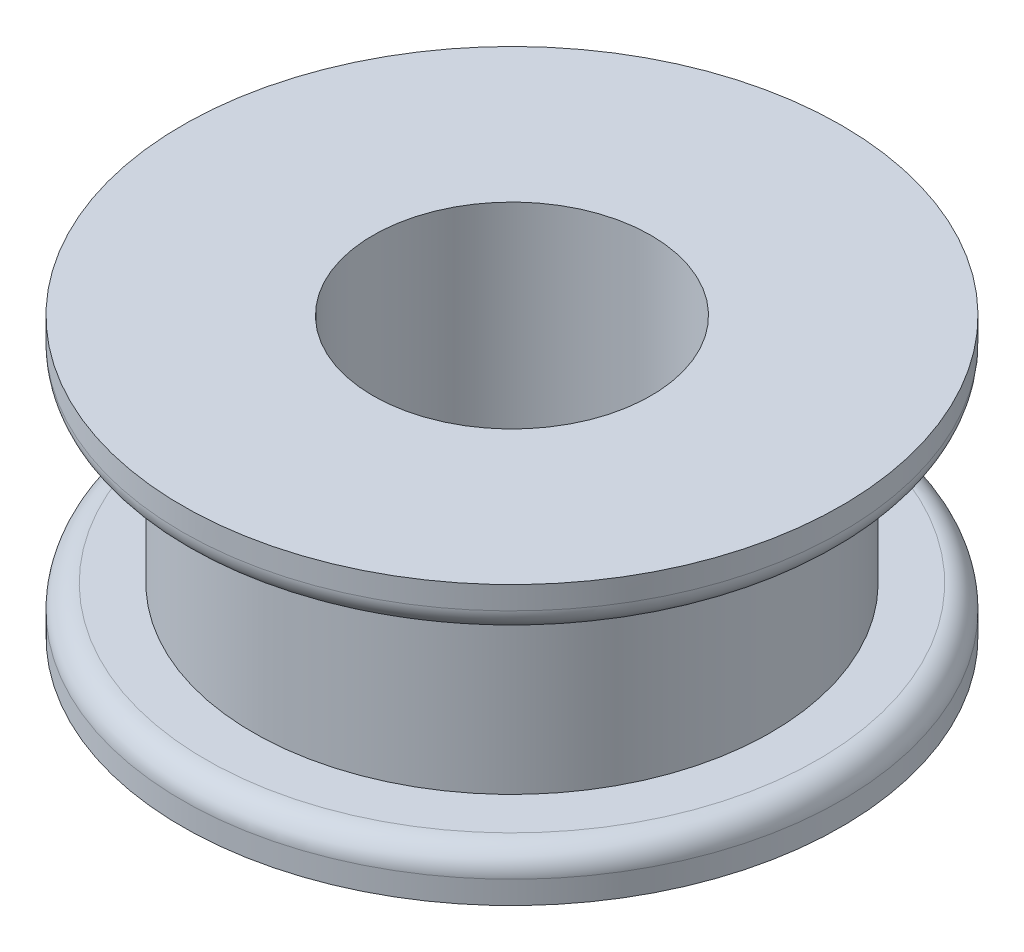
ISO-10303-21;
HEADER;
FILE_DESCRIPTION(('STEP AP214'),'2;1');
FILE_NAME('part.step','',(''),(''),'','','');
FILE_SCHEMA(('AUTOMOTIVE_DESIGN { 1 0 10303 214 1 1 1 1 }'));
ENDSEC;
DATA;
#1=APPLICATION_CONTEXT('core data for automotive mechanical design processes');
#2=APPLICATION_PROTOCOL_DEFINITION('international standard','automotive_design',2000,#1);
#3=PRODUCT_CONTEXT('',#1,'mechanical');
#4=PRODUCT('Part','Part','',(#3));
#5=PRODUCT_RELATED_PRODUCT_CATEGORY('part','',(#4));
#6=PRODUCT_DEFINITION_FORMATION('','',#4);
#7=PRODUCT_DEFINITION_CONTEXT('part definition',#1,'design');
#8=PRODUCT_DEFINITION('design','',#6,#7);
#9=PRODUCT_DEFINITION_SHAPE('','',#8);
#10=(LENGTH_UNIT() NAMED_UNIT(*) SI_UNIT(.MILLI.,.METRE.));
#11=(NAMED_UNIT(*) PLANE_ANGLE_UNIT() SI_UNIT($,.RADIAN.));
#12=(NAMED_UNIT(*) SI_UNIT($,.STERADIAN.) SOLID_ANGLE_UNIT());
#13=UNCERTAINTY_MEASURE_WITH_UNIT(LENGTH_MEASURE(1.E-05),#10,'distance_accuracy_value','');
#14=(GEOMETRIC_REPRESENTATION_CONTEXT(3) GLOBAL_UNCERTAINTY_ASSIGNED_CONTEXT((#13)) GLOBAL_UNIT_ASSIGNED_CONTEXT((#10,
#11,#12)) REPRESENTATION_CONTEXT('',''));
#15=CARTESIAN_POINT('',(0.,0.,0.));
#16=DIRECTION('',(0.,0.,1.));
#17=DIRECTION('',(1.,0.,0.));
#18=AXIS2_PLACEMENT_3D('',#15,#16,#17);
#19=CARTESIAN_POINT('',(0.,0.,7.112));
#20=DIRECTION('',(0.,-1.,0.));
#21=DIRECTION('',(0.,0.,-1.));
#22=AXIS2_PLACEMENT_3D('',#19,#20,#21);
#23=PLANE('',#22);
#24=CARTESIAN_POINT('',(0.,0.,0.));
#25=DIRECTION('',(0.,-1.,0.));
#26=DIRECTION('',(0.,0.,-1.));
#27=AXIS2_PLACEMENT_3D('',#24,#25,#26);
#28=CIRCLE('',#27,7.112);
#29=CARTESIAN_POINT('',(0.,0.,-7.112));
#30=VERTEX_POINT('',#29);
#31=EDGE_CURVE('E87',#30,#30,#28,.T.);
#32=ORIENTED_EDGE('',*,*,#31,.F.);
#33=EDGE_LOOP('',(#32));
#34=FACE_BOUND('',#33,.T.);
#35=CARTESIAN_POINT('',(0.,0.,0.));
#36=DIRECTION('',(0.,-1.,0.));
#37=DIRECTION('',(0.,0.,-1.));
#38=AXIS2_PLACEMENT_3D('',#35,#36,#37);
#39=CIRCLE('',#38,3.000000096);
#40=CARTESIAN_POINT('',(0.,0.,-3.000000096));
#41=VERTEX_POINT('',#40);
#42=EDGE_CURVE('E67',#41,#41,#39,.T.);
#43=ORIENTED_EDGE('',*,*,#42,.T.);
#44=EDGE_LOOP('',(#43));
#45=FACE_BOUND('',#44,.T.);
#46=ADVANCED_FACE('F43',(#34,#45),#23,.F.);
#47=CARTESIAN_POINT('',(0.,-39.0415865134538,0.));
#48=DIRECTION('',(0.,-1.,0.));
#49=DIRECTION('',(0.,0.,-1.));
#50=AXIS2_PLACEMENT_3D('',#47,#48,#49);
#51=CYLINDRICAL_SURFACE('',#50,3.000000096);
#52=ORIENTED_EDGE('',*,*,#42,.F.);
#53=EDGE_LOOP('',(#52));
#54=FACE_BOUND('',#53,.T.);
#55=CARTESIAN_POINT('',(0.,-6.000000192,0.));
#56=DIRECTION('',(0.,-1.,0.));
#57=DIRECTION('',(0.,0.,-1.));
#58=AXIS2_PLACEMENT_3D('',#55,#56,#57);
#59=CIRCLE('',#58,3.000000096);
#60=CARTESIAN_POINT('',(0.,-6.000000192,-3.000000096));
#61=VERTEX_POINT('',#60);
#62=EDGE_CURVE('E71',#61,#61,#59,.T.);
#63=ORIENTED_EDGE('',*,*,#62,.T.);
#64=EDGE_LOOP('',(#63));
#65=FACE_BOUND('',#64,.T.);
#66=ADVANCED_FACE('F96',(#54,#65),#51,.F.);
#67=CARTESIAN_POINT('',(0.,-6.000000192,3.000000096));
#68=DIRECTION('',(0.,1.,0.));
#69=DIRECTION('',(0.,0.,1.));
#70=AXIS2_PLACEMENT_3D('',#67,#68,#69);
#71=PLANE('',#70);
#72=ORIENTED_EDGE('',*,*,#62,.F.);
#73=EDGE_LOOP('',(#72));
#74=FACE_BOUND('',#73,.T.);
#75=CARTESIAN_POINT('',(0.,-6.000000192,0.));
#76=DIRECTION('',(0.,-1.,0.));
#77=DIRECTION('',(0.,0.,-1.));
#78=AXIS2_PLACEMENT_3D('',#75,#76,#77);
#79=CIRCLE('',#78,7.112);
#80=CARTESIAN_POINT('',(0.,-6.000000192,-7.112));
#81=VERTEX_POINT('',#80);
#82=EDGE_CURVE('E75',#81,#81,#79,.T.);
#83=ORIENTED_EDGE('',*,*,#82,.T.);
#84=EDGE_LOOP('',(#83));
#85=FACE_BOUND('',#84,.T.);
#86=ADVANCED_FACE('F102',(#74,#85),#71,.F.);
#87=CARTESIAN_POINT('',(0.,-39.0415865134538,0.));
#88=DIRECTION('',(0.,-1.,0.));
#89=DIRECTION('',(0.,0.,-1.));
#90=AXIS2_PLACEMENT_3D('',#87,#88,#89);
#91=CYLINDRICAL_SURFACE('',#90,7.112);
#92=CARTESIAN_POINT('',(0.,-5.50800016,0.));
#93=DIRECTION('',(0.,-1.,0.));
#94=DIRECTION('',(0.,0.,-1.));
#95=AXIS2_PLACEMENT_3D('',#92,#93,#94);
#96=CIRCLE('',#95,7.112);
#97=CARTESIAN_POINT('',(0.,-5.50800016,-7.112));
#98=VERTEX_POINT('',#97);
#99=EDGE_CURVE('E61',#98,#98,#96,.T.);
#100=ORIENTED_EDGE('',*,*,#99,.T.);
#101=EDGE_LOOP('',(#100));
#102=FACE_BOUND('',#101,.T.);
#103=ORIENTED_EDGE('',*,*,#82,.F.);
#104=EDGE_LOOP('',(#103));
#105=FACE_BOUND('',#104,.T.);
#106=ADVANCED_FACE('F108',(#102,#105),#91,.T.);
#107=CARTESIAN_POINT('',(0.,-5.00000016,7.112));
#108=DIRECTION('',(0.,-1.,0.));
#109=DIRECTION('',(0.,0.,-1.));
#110=AXIS2_PLACEMENT_3D('',#107,#108,#109);
#111=PLANE('',#110);
#112=CARTESIAN_POINT('',(0.,-5.00000016,0.));
#113=DIRECTION('',(0.,-1.,0.));
#114=DIRECTION('',(0.,0.,-1.));
#115=AXIS2_PLACEMENT_3D('',#112,#113,#114);
#116=CIRCLE('',#115,6.604);
#117=CARTESIAN_POINT('',(0.,-5.00000016,-6.604));
#118=VERTEX_POINT('',#117);
#119=EDGE_CURVE('E56',#118,#118,#116,.F.);
#120=ORIENTED_EDGE('',*,*,#119,.T.);
#121=EDGE_LOOP('',(#120));
#122=FACE_BOUND('',#121,.T.);
#123=CARTESIAN_POINT('',(0.,-5.00000016,0.));
#124=DIRECTION('',(0.,-1.,0.));
#125=DIRECTION('',(0.,0.,-1.));
#126=AXIS2_PLACEMENT_3D('',#123,#124,#125);
#127=CIRCLE('',#126,5.588);
#128=CARTESIAN_POINT('',(0.,-5.00000016,-5.588));
#129=VERTEX_POINT('',#128);
#130=EDGE_CURVE('E79',#129,#129,#127,.T.);
#131=ORIENTED_EDGE('',*,*,#130,.T.);
#132=EDGE_LOOP('',(#131));
#133=FACE_BOUND('',#132,.T.);
#134=ADVANCED_FACE('F113',(#122,#133),#111,.F.);
#135=CARTESIAN_POINT('',(0.,-39.0415865134538,0.));
#136=DIRECTION('',(0.,-1.,0.));
#137=DIRECTION('',(0.,0.,-1.));
#138=AXIS2_PLACEMENT_3D('',#135,#136,#137);
#139=CYLINDRICAL_SURFACE('',#138,5.588);
#140=ORIENTED_EDGE('',*,*,#130,.F.);
#141=EDGE_LOOP('',(#140));
#142=FACE_BOUND('',#141,.T.);
#143=CARTESIAN_POINT('',(0.,-1.000000032,0.));
#144=DIRECTION('',(0.,-1.,0.));
#145=DIRECTION('',(0.,0.,-1.));
#146=AXIS2_PLACEMENT_3D('',#143,#144,#145);
#147=CIRCLE('',#146,5.588);
#148=CARTESIAN_POINT('',(0.,-1.000000032,-5.588));
#149=VERTEX_POINT('',#148);
#150=EDGE_CURVE('E83',#149,#149,#147,.T.);
#151=ORIENTED_EDGE('',*,*,#150,.T.);
#152=EDGE_LOOP('',(#151));
#153=FACE_BOUND('',#152,.T.);
#154=ADVANCED_FACE('F120',(#142,#153),#139,.T.);
#155=CARTESIAN_POINT('',(0.,-1.000000032,5.588));
#156=DIRECTION('',(0.,1.,0.));
#157=DIRECTION('',(0.,0.,1.));
#158=AXIS2_PLACEMENT_3D('',#155,#156,#157);
#159=PLANE('',#158);
#160=CARTESIAN_POINT('',(0.,-1.000000032,0.));
#161=DIRECTION('',(0.,1.,0.));
#162=DIRECTION('',(0.,0.,1.));
#163=AXIS2_PLACEMENT_3D('',#160,#161,#162);
#164=CIRCLE('',#163,6.604);
#165=CARTESIAN_POINT('',(0.,-1.000000032,6.604));
#166=VERTEX_POINT('',#165);
#167=EDGE_CURVE('E51',#166,#166,#164,.F.);
#168=ORIENTED_EDGE('',*,*,#167,.T.);
#169=EDGE_LOOP('',(#168));
#170=FACE_BOUND('',#169,.T.);
#171=ORIENTED_EDGE('',*,*,#150,.F.);
#172=EDGE_LOOP('',(#171));
#173=FACE_BOUND('',#172,.T.);
#174=ADVANCED_FACE('F132',(#170,#173),#159,.F.);
#175=CARTESIAN_POINT('',(0.,-39.0415865134538,0.));
#176=DIRECTION('',(0.,-1.,0.));
#177=DIRECTION('',(0.,0.,-1.));
#178=AXIS2_PLACEMENT_3D('',#175,#176,#177);
#179=CYLINDRICAL_SURFACE('',#178,7.112);
#180=CARTESIAN_POINT('',(0.,-0.492000031999999,0.));
#181=DIRECTION('',(0.,1.,0.));
#182=DIRECTION('',(0.,0.,1.));
#183=AXIS2_PLACEMENT_3D('',#180,#181,#182);
#184=CIRCLE('',#183,7.112);
#185=CARTESIAN_POINT('',(0.,-0.492000031999999,7.112));
#186=VERTEX_POINT('',#185);
#187=EDGE_CURVE('E10',#186,#186,#184,.T.);
#188=ORIENTED_EDGE('',*,*,#187,.T.);
#189=EDGE_LOOP('',(#188));
#190=FACE_BOUND('',#189,.T.);
#191=ORIENTED_EDGE('',*,*,#31,.T.);
#192=EDGE_LOOP('',(#191));
#193=FACE_BOUND('',#192,.T.);
#194=ADVANCED_FACE('F92',(#190,#193),#179,.T.);
#195=CARTESIAN_POINT('',(0.,-5.50800016,0.));
#196=DIRECTION('',(0.,-1.,0.));
#197=DIRECTION('',(0.,0.,-1.));
#198=AXIS2_PLACEMENT_3D('',#195,#196,#197);
#199=TOROIDAL_SURFACE('',#198,6.604,0.508);
#200=ORIENTED_EDGE('',*,*,#119,.F.);
#201=EDGE_LOOP('',(#200));
#202=FACE_BOUND('',#201,.T.);
#203=ORIENTED_EDGE('',*,*,#99,.F.);
#204=EDGE_LOOP('',(#203));
#205=FACE_BOUND('',#204,.T.);
#206=ADVANCED_FACE('F124',(#202,#205),#199,.T.);
#207=CARTESIAN_POINT('',(0.,-0.492000031999999,0.));
#208=DIRECTION('',(0.,1.,0.));
#209=DIRECTION('',(0.,0.,1.));
#210=AXIS2_PLACEMENT_3D('',#207,#208,#209);
#211=TOROIDAL_SURFACE('',#210,6.604,0.508);
#212=ORIENTED_EDGE('',*,*,#187,.F.);
#213=EDGE_LOOP('',(#212));
#214=FACE_BOUND('',#213,.T.);
#215=ORIENTED_EDGE('',*,*,#167,.F.);
#216=EDGE_LOOP('',(#215));
#217=FACE_BOUND('',#216,.T.);
#218=ADVANCED_FACE('F45',(#214,#217),#211,.T.);
#219=CLOSED_SHELL('',(#46,#66,#86,#106,#134,#154,#174,#194,#206,#218));
#220=MANIFOLD_SOLID_BREP('B2',#219);
#221=ADVANCED_BREP_SHAPE_REPRESENTATION('',(#18,#220),#14);
#222=SHAPE_DEFINITION_REPRESENTATION(#9,#221);
ENDSEC;
END-ISO-10303-21;
